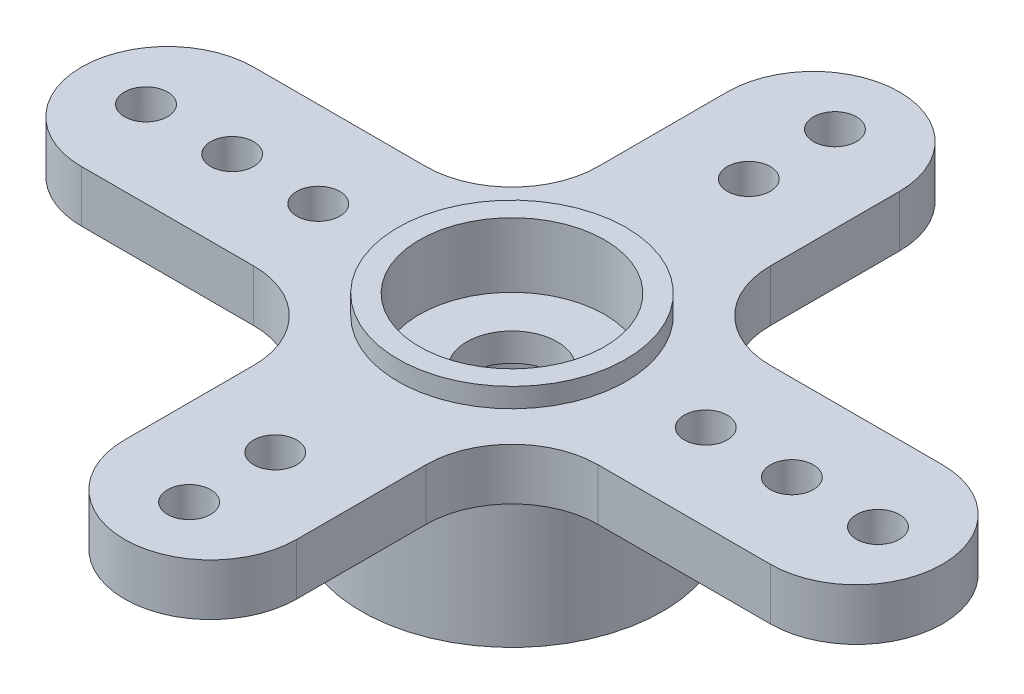
ISO-10303-21;
HEADER;
FILE_DESCRIPTION(('STEP AP214'),'2;1');
FILE_NAME('part.step','',(''),(''),'','','');
FILE_SCHEMA(('AUTOMOTIVE_DESIGN { 1 0 10303 214 1 1 1 1 }'));
ENDSEC;
DATA;
#1=APPLICATION_CONTEXT('core data for automotive mechanical design processes');
#2=APPLICATION_PROTOCOL_DEFINITION('international standard','automotive_design',2000,#1);
#3=PRODUCT_CONTEXT('',#1,'mechanical');
#4=PRODUCT('Part','Part','',(#3));
#5=PRODUCT_RELATED_PRODUCT_CATEGORY('part','',(#4));
#6=PRODUCT_DEFINITION_FORMATION('','',#4);
#7=PRODUCT_DEFINITION_CONTEXT('part definition',#1,'design');
#8=PRODUCT_DEFINITION('design','',#6,#7);
#9=PRODUCT_DEFINITION_SHAPE('','',#8);
#10=(LENGTH_UNIT() NAMED_UNIT(*) SI_UNIT(.MILLI.,.METRE.));
#11=(NAMED_UNIT(*) PLANE_ANGLE_UNIT() SI_UNIT($,.RADIAN.));
#12=(NAMED_UNIT(*) SI_UNIT($,.STERADIAN.) SOLID_ANGLE_UNIT());
#13=UNCERTAINTY_MEASURE_WITH_UNIT(LENGTH_MEASURE(1.E-05),#10,'distance_accuracy_value','');
#14=(GEOMETRIC_REPRESENTATION_CONTEXT(3) GLOBAL_UNCERTAINTY_ASSIGNED_CONTEXT((#13)) GLOBAL_UNIT_ASSIGNED_CONTEXT((#10,
#11,#12)) REPRESENTATION_CONTEXT('',''));
#15=CARTESIAN_POINT('',(0.,0.,0.));
#16=DIRECTION('',(0.,0.,1.));
#17=DIRECTION('',(1.,0.,0.));
#18=AXIS2_PLACEMENT_3D('',#15,#16,#17);
#19=CARTESIAN_POINT('',(3.5,0.500000000000001,0.));
#20=DIRECTION('',(0.,-1.,0.));
#21=DIRECTION('',(0.,0.,-1.));
#22=AXIS2_PLACEMENT_3D('',#19,#20,#21);
#23=PLANE('',#22);
#24=CARTESIAN_POINT('',(0.,0.5,0.));
#25=DIRECTION('',(0.,-1.,0.));
#26=DIRECTION('',(0.,0.,-1.));
#27=AXIS2_PLACEMENT_3D('',#24,#25,#26);
#28=CIRCLE('',#27,3.5);
#29=CARTESIAN_POINT('',(0.,0.5,-3.5));
#30=VERTEX_POINT('',#29);
#31=EDGE_CURVE('E209',#30,#30,#28,.T.);
#32=ORIENTED_EDGE('',*,*,#31,.F.);
#33=EDGE_LOOP('',(#32));
#34=FACE_BOUND('',#33,.T.);
#35=CARTESIAN_POINT('',(-6.5,0.500000000000001,0.));
#36=DIRECTION('',(0.,-1.,0.));
#37=DIRECTION('',(0.,0.,-1.));
#38=AXIS2_PLACEMENT_3D('',#35,#36,#37);
#39=CIRCLE('',#38,0.499999999999929);
#40=CARTESIAN_POINT('',(-6.5,0.500000000000001,-0.499999999999929));
#41=VERTEX_POINT('',#40);
#42=EDGE_CURVE('E233',#41,#41,#39,.T.);
#43=ORIENTED_EDGE('',*,*,#42,.F.);
#44=EDGE_LOOP('',(#43));
#45=FACE_BOUND('',#44,.T.);
#46=CARTESIAN_POINT('',(-4.5,0.500000000000001,0.));
#47=DIRECTION('',(0.,-1.,0.));
#48=DIRECTION('',(0.,0.,-1.));
#49=AXIS2_PLACEMENT_3D('',#46,#47,#48);
#50=CIRCLE('',#49,0.499999999999929);
#51=CARTESIAN_POINT('',(-4.5,0.500000000000001,-0.499999999999929));
#52=VERTEX_POINT('',#51);
#53=EDGE_CURVE('E239',#52,#52,#50,.T.);
#54=ORIENTED_EDGE('',*,*,#53,.F.);
#55=EDGE_LOOP('',(#54));
#56=FACE_BOUND('',#55,.T.);
#57=CARTESIAN_POINT('',(-8.5,0.500000000000001,0.));
#58=DIRECTION('',(0.,-1.,0.));
#59=DIRECTION('',(0.,0.,-1.));
#60=AXIS2_PLACEMENT_3D('',#57,#58,#59);
#61=CIRCLE('',#60,0.499999999999928);
#62=CARTESIAN_POINT('',(-8.5,0.500000000000001,-0.499999999999928));
#63=VERTEX_POINT('',#62);
#64=EDGE_CURVE('E245',#63,#63,#61,.T.);
#65=ORIENTED_EDGE('',*,*,#64,.F.);
#66=EDGE_LOOP('',(#65));
#67=FACE_BOUND('',#66,.T.);
#68=CARTESIAN_POINT('',(6.5,0.500000000000001,0.));
#69=DIRECTION('',(0.,-1.,0.));
#70=DIRECTION('',(0.,0.,-1.));
#71=AXIS2_PLACEMENT_3D('',#68,#69,#70);
#72=CIRCLE('',#71,0.499999999999929);
#73=CARTESIAN_POINT('',(6.5,0.500000000000001,-0.499999999999929));
#74=VERTEX_POINT('',#73);
#75=EDGE_CURVE('E251',#74,#74,#72,.T.);
#76=ORIENTED_EDGE('',*,*,#75,.F.);
#77=EDGE_LOOP('',(#76));
#78=FACE_BOUND('',#77,.T.);
#79=CARTESIAN_POINT('',(4.5,0.500000000000001,0.));
#80=DIRECTION('',(0.,-1.,0.));
#81=DIRECTION('',(0.,0.,-1.));
#82=AXIS2_PLACEMENT_3D('',#79,#80,#81);
#83=CIRCLE('',#82,0.499999999999929);
#84=CARTESIAN_POINT('',(4.5,0.500000000000001,-0.499999999999929));
#85=VERTEX_POINT('',#84);
#86=EDGE_CURVE('E257',#85,#85,#83,.T.);
#87=ORIENTED_EDGE('',*,*,#86,.F.);
#88=EDGE_LOOP('',(#87));
#89=FACE_BOUND('',#88,.T.);
#90=CARTESIAN_POINT('',(8.5,0.500000000000001,0.));
#91=DIRECTION('',(0.,-1.,0.));
#92=DIRECTION('',(0.,0.,-1.));
#93=AXIS2_PLACEMENT_3D('',#90,#91,#92);
#94=CIRCLE('',#93,0.499999999999928);
#95=CARTESIAN_POINT('',(8.5,0.500000000000001,-0.499999999999928));
#96=VERTEX_POINT('',#95);
#97=EDGE_CURVE('E263',#96,#96,#94,.T.);
#98=ORIENTED_EDGE('',*,*,#97,.F.);
#99=EDGE_LOOP('',(#98));
#100=FACE_BOUND('',#99,.T.);
#101=CARTESIAN_POINT('',(0.,0.500000000000001,-7.5));
#102=DIRECTION('',(0.,-1.,0.));
#103=DIRECTION('',(0.,0.,-1.));
#104=AXIS2_PLACEMENT_3D('',#101,#102,#103);
#105=CIRCLE('',#104,0.499999999999966);
#106=CARTESIAN_POINT('',(0.,0.500000000000001,-7.99999999999997));
#107=VERTEX_POINT('',#106);
#108=EDGE_CURVE('E269',#107,#107,#105,.T.);
#109=ORIENTED_EDGE('',*,*,#108,.F.);
#110=EDGE_LOOP('',(#109));
#111=FACE_BOUND('',#110,.T.);
#112=CARTESIAN_POINT('',(0.,0.500000000000001,-5.5));
#113=DIRECTION('',(0.,-1.,0.));
#114=DIRECTION('',(0.,0.,-1.));
#115=AXIS2_PLACEMENT_3D('',#112,#113,#114);
#116=CIRCLE('',#115,0.499999999999966);
#117=CARTESIAN_POINT('',(0.,0.500000000000001,-5.99999999999997));
#118=VERTEX_POINT('',#117);
#119=EDGE_CURVE('E275',#118,#118,#116,.T.);
#120=ORIENTED_EDGE('',*,*,#119,.F.);
#121=EDGE_LOOP('',(#120));
#122=FACE_BOUND('',#121,.T.);
#123=CARTESIAN_POINT('',(0.,0.500000000000001,7.5));
#124=DIRECTION('',(0.,-1.,0.));
#125=DIRECTION('',(0.,0.,-1.));
#126=AXIS2_PLACEMENT_3D('',#123,#124,#125);
#127=CIRCLE('',#126,0.499999999999966);
#128=CARTESIAN_POINT('',(0.,0.500000000000001,7.00000000000003));
#129=VERTEX_POINT('',#128);
#130=EDGE_CURVE('E281',#129,#129,#127,.T.);
#131=ORIENTED_EDGE('',*,*,#130,.F.);
#132=EDGE_LOOP('',(#131));
#133=FACE_BOUND('',#132,.T.);
#134=CARTESIAN_POINT('',(0.,0.500000000000001,5.5));
#135=DIRECTION('',(0.,-1.,0.));
#136=DIRECTION('',(0.,0.,-1.));
#137=AXIS2_PLACEMENT_3D('',#134,#135,#136);
#138=CIRCLE('',#137,0.499999999999966);
#139=CARTESIAN_POINT('',(0.,0.500000000000001,5.00000000000003));
#140=VERTEX_POINT('',#139);
#141=EDGE_CURVE('E287',#140,#140,#138,.T.);
#142=ORIENTED_EDGE('',*,*,#141,.F.);
#143=EDGE_LOOP('',(#142));
#144=FACE_BOUND('',#143,.T.);
#145=DIRECTION('',(-1.,0.,0.));
#146=VECTOR('',#145,1.);
#147=CARTESIAN_POINT('',(3.5,0.500000000000001,2.));
#148=LINE('',#147,#146);
#149=CARTESIAN_POINT('',(8.,0.5,2.));
#150=VERTEX_POINT('',#149);
#151=CARTESIAN_POINT('',(4.,0.500000000000001,2.));
#152=VERTEX_POINT('',#151);
#153=EDGE_CURVE('E336',#150,#152,#148,.T.);
#154=ORIENTED_EDGE('',*,*,#153,.T.);
#155=CARTESIAN_POINT('',(4.,0.5,4.));
#156=DIRECTION('',(0.,-1.,0.));
#157=DIRECTION('',(0.,0.,-1.));
#158=AXIS2_PLACEMENT_3D('',#155,#156,#157);
#159=CIRCLE('',#158,2.);
#160=CARTESIAN_POINT('',(2.,0.5,4.));
#161=VERTEX_POINT('',#160);
#162=EDGE_CURVE('E151',#152,#161,#159,.F.);
#163=ORIENTED_EDGE('',*,*,#162,.T.);
#164=DIRECTION('',(0.,0.,1.));
#165=VECTOR('',#164,1.);
#166=CARTESIAN_POINT('',(2.,0.500000000000001,0.));
#167=LINE('',#166,#165);
#168=CARTESIAN_POINT('',(2.,0.5,7.));
#169=VERTEX_POINT('',#168);
#170=EDGE_CURVE('E294',#161,#169,#167,.T.);
#171=ORIENTED_EDGE('',*,*,#170,.T.);
#172=CARTESIAN_POINT('',(0.,0.5,7.));
#173=DIRECTION('',(0.,-1.,0.));
#174=DIRECTION('',(0.,0.,-1.));
#175=AXIS2_PLACEMENT_3D('',#172,#173,#174);
#176=CIRCLE('',#175,2.);
#177=CARTESIAN_POINT('',(-2.,0.5,7.));
#178=VERTEX_POINT('',#177);
#179=EDGE_CURVE('E297',#169,#178,#176,.T.);
#180=ORIENTED_EDGE('',*,*,#179,.T.);
#181=DIRECTION('',(0.,0.,-1.));
#182=VECTOR('',#181,1.);
#183=CARTESIAN_POINT('',(-2.,0.500000000000001,0.));
#184=LINE('',#183,#182);
#185=CARTESIAN_POINT('',(-2.,0.5,4.));
#186=VERTEX_POINT('',#185);
#187=EDGE_CURVE('E300',#178,#186,#184,.T.);
#188=ORIENTED_EDGE('',*,*,#187,.T.);
#189=CARTESIAN_POINT('',(-4.,0.5,4.));
#190=DIRECTION('',(0.,-1.,0.));
#191=DIRECTION('',(0.,0.,-1.));
#192=AXIS2_PLACEMENT_3D('',#189,#190,#191);
#193=CIRCLE('',#192,2.);
#194=CARTESIAN_POINT('',(-4.,0.5,2.));
#195=VERTEX_POINT('',#194);
#196=EDGE_CURVE('E303',#186,#195,#193,.F.);
#197=ORIENTED_EDGE('',*,*,#196,.T.);
#198=DIRECTION('',(-1.,0.,0.));
#199=VECTOR('',#198,1.);
#200=CARTESIAN_POINT('',(3.5,0.500000000000001,2.));
#201=LINE('',#200,#199);
#202=CARTESIAN_POINT('',(-8.,0.5,2.));
#203=VERTEX_POINT('',#202);
#204=EDGE_CURVE('E306',#195,#203,#201,.T.);
#205=ORIENTED_EDGE('',*,*,#204,.T.);
#206=CARTESIAN_POINT('',(-8.,0.5,0.));
#207=DIRECTION('',(0.,-1.,0.));
#208=DIRECTION('',(0.,0.,-1.));
#209=AXIS2_PLACEMENT_3D('',#206,#207,#208);
#210=CIRCLE('',#209,2.);
#211=CARTESIAN_POINT('',(-8.,0.5,-2.));
#212=VERTEX_POINT('',#211);
#213=EDGE_CURVE('E309',#203,#212,#210,.T.);
#214=ORIENTED_EDGE('',*,*,#213,.T.);
#215=DIRECTION('',(1.,0.,0.));
#216=VECTOR('',#215,1.);
#217=CARTESIAN_POINT('',(3.5,0.500000000000001,-2.));
#218=LINE('',#217,#216);
#219=CARTESIAN_POINT('',(-4.,0.5,-2.));
#220=VERTEX_POINT('',#219);
#221=EDGE_CURVE('E312',#212,#220,#218,.T.);
#222=ORIENTED_EDGE('',*,*,#221,.T.);
#223=CARTESIAN_POINT('',(-4.,0.5,-4.));
#224=DIRECTION('',(0.,-1.,0.));
#225=DIRECTION('',(0.,0.,-1.));
#226=AXIS2_PLACEMENT_3D('',#223,#224,#225);
#227=CIRCLE('',#226,2.);
#228=CARTESIAN_POINT('',(-2.,0.5,-4.));
#229=VERTEX_POINT('',#228);
#230=EDGE_CURVE('E315',#220,#229,#227,.F.);
#231=ORIENTED_EDGE('',*,*,#230,.T.);
#232=DIRECTION('',(0.,0.,-1.));
#233=VECTOR('',#232,1.);
#234=CARTESIAN_POINT('',(-2.,0.500000000000001,0.));
#235=LINE('',#234,#233);
#236=CARTESIAN_POINT('',(-2.,0.5,-7.));
#237=VERTEX_POINT('',#236);
#238=EDGE_CURVE('E318',#229,#237,#235,.T.);
#239=ORIENTED_EDGE('',*,*,#238,.T.);
#240=CARTESIAN_POINT('',(0.,0.5,-7.));
#241=DIRECTION('',(0.,-1.,0.));
#242=DIRECTION('',(0.,0.,-1.));
#243=AXIS2_PLACEMENT_3D('',#240,#241,#242);
#244=CIRCLE('',#243,2.);
#245=CARTESIAN_POINT('',(2.,0.5,-7.));
#246=VERTEX_POINT('',#245);
#247=EDGE_CURVE('E321',#237,#246,#244,.T.);
#248=ORIENTED_EDGE('',*,*,#247,.T.);
#249=DIRECTION('',(0.,0.,1.));
#250=VECTOR('',#249,1.);
#251=CARTESIAN_POINT('',(2.,0.500000000000001,0.));
#252=LINE('',#251,#250);
#253=CARTESIAN_POINT('',(2.,0.5,-4.));
#254=VERTEX_POINT('',#253);
#255=EDGE_CURVE('E324',#246,#254,#252,.T.);
#256=ORIENTED_EDGE('',*,*,#255,.T.);
#257=CARTESIAN_POINT('',(4.,0.5,-4.));
#258=DIRECTION('',(0.,-1.,0.));
#259=DIRECTION('',(0.,0.,-1.));
#260=AXIS2_PLACEMENT_3D('',#257,#258,#259);
#261=CIRCLE('',#260,2.);
#262=CARTESIAN_POINT('',(4.,0.5,-2.));
#263=VERTEX_POINT('',#262);
#264=EDGE_CURVE('E327',#254,#263,#261,.F.);
#265=ORIENTED_EDGE('',*,*,#264,.T.);
#266=DIRECTION('',(1.,0.,0.));
#267=VECTOR('',#266,1.);
#268=CARTESIAN_POINT('',(3.5,0.500000000000001,-2.));
#269=LINE('',#268,#267);
#270=CARTESIAN_POINT('',(8.,0.5,-2.));
#271=VERTEX_POINT('',#270);
#272=EDGE_CURVE('E330',#263,#271,#269,.T.);
#273=ORIENTED_EDGE('',*,*,#272,.T.);
#274=CARTESIAN_POINT('',(8.,0.5,0.));
#275=DIRECTION('',(0.,-1.,0.));
#276=DIRECTION('',(0.,0.,-1.));
#277=AXIS2_PLACEMENT_3D('',#274,#275,#276);
#278=CIRCLE('',#277,2.);
#279=EDGE_CURVE('E333',#271,#150,#278,.T.);
#280=ORIENTED_EDGE('',*,*,#279,.T.);
#281=EDGE_LOOP('',(#154,#163,#171,#180,#188,#197,#205,#214,#222,#231,#239,#248,#256,#265,#273,#280));
#282=FACE_BOUND('',#281,.T.);
#283=ADVANCED_FACE('F37',(#34,#45,#56,#67,#78,#89,#100,#111,#122,#133,#144,#282),#23,.T.);
#284=CARTESIAN_POINT('',(25.,1.7,0.));
#285=DIRECTION('',(0.,1.,0.));
#286=DIRECTION('',(0.,0.,1.));
#287=AXIS2_PLACEMENT_3D('',#284,#285,#286);
#288=PLANE('',#287);
#289=CARTESIAN_POINT('',(0.,1.7,0.));
#290=DIRECTION('',(0.,-1.,0.));
#291=DIRECTION('',(0.,0.,-1.));
#292=AXIS2_PLACEMENT_3D('',#289,#290,#291);
#293=CIRCLE('',#292,2.65);
#294=CARTESIAN_POINT('',(0.,1.7,-2.65));
#295=VERTEX_POINT('',#294);
#296=EDGE_CURVE('E212',#295,#295,#293,.T.);
#297=ORIENTED_EDGE('',*,*,#296,.T.);
#298=EDGE_LOOP('',(#297));
#299=FACE_BOUND('',#298,.T.);
#300=CARTESIAN_POINT('',(-6.5,1.7,0.));
#301=DIRECTION('',(0.,1.,0.));
#302=DIRECTION('',(0.,0.,1.));
#303=AXIS2_PLACEMENT_3D('',#300,#301,#302);
#304=CIRCLE('',#303,0.499999999999953);
#305=CARTESIAN_POINT('',(-6.5,1.7,0.499999999999953));
#306=VERTEX_POINT('',#305);
#307=EDGE_CURVE('E236',#306,#306,#304,.T.);
#308=ORIENTED_EDGE('',*,*,#307,.F.);
#309=EDGE_LOOP('',(#308));
#310=FACE_BOUND('',#309,.T.);
#311=CARTESIAN_POINT('',(-4.5,1.7,0.));
#312=DIRECTION('',(0.,1.,0.));
#313=DIRECTION('',(0.,0.,1.));
#314=AXIS2_PLACEMENT_3D('',#311,#312,#313);
#315=CIRCLE('',#314,0.499999999999953);
#316=CARTESIAN_POINT('',(-4.5,1.7,0.499999999999953));
#317=VERTEX_POINT('',#316);
#318=EDGE_CURVE('E242',#317,#317,#315,.T.);
#319=ORIENTED_EDGE('',*,*,#318,.F.);
#320=EDGE_LOOP('',(#319));
#321=FACE_BOUND('',#320,.T.);
#322=CARTESIAN_POINT('',(-8.5,1.7,0.));
#323=DIRECTION('',(0.,1.,0.));
#324=DIRECTION('',(0.,0.,1.));
#325=AXIS2_PLACEMENT_3D('',#322,#323,#324);
#326=CIRCLE('',#325,0.499999999999952);
#327=CARTESIAN_POINT('',(-8.5,1.7,0.499999999999952));
#328=VERTEX_POINT('',#327);
#329=EDGE_CURVE('E248',#328,#328,#326,.T.);
#330=ORIENTED_EDGE('',*,*,#329,.F.);
#331=EDGE_LOOP('',(#330));
#332=FACE_BOUND('',#331,.T.);
#333=CARTESIAN_POINT('',(6.5,1.7,0.));
#334=DIRECTION('',(0.,1.,0.));
#335=DIRECTION('',(0.,0.,1.));
#336=AXIS2_PLACEMENT_3D('',#333,#334,#335);
#337=CIRCLE('',#336,0.499999999999953);
#338=CARTESIAN_POINT('',(6.5,1.7,0.499999999999953));
#339=VERTEX_POINT('',#338);
#340=EDGE_CURVE('E254',#339,#339,#337,.T.);
#341=ORIENTED_EDGE('',*,*,#340,.F.);
#342=EDGE_LOOP('',(#341));
#343=FACE_BOUND('',#342,.T.);
#344=CARTESIAN_POINT('',(4.5,1.7,0.));
#345=DIRECTION('',(0.,1.,0.));
#346=DIRECTION('',(0.,0.,1.));
#347=AXIS2_PLACEMENT_3D('',#344,#345,#346);
#348=CIRCLE('',#347,0.499999999999953);
#349=CARTESIAN_POINT('',(4.5,1.7,0.499999999999953));
#350=VERTEX_POINT('',#349);
#351=EDGE_CURVE('E260',#350,#350,#348,.T.);
#352=ORIENTED_EDGE('',*,*,#351,.F.);
#353=EDGE_LOOP('',(#352));
#354=FACE_BOUND('',#353,.T.);
#355=CARTESIAN_POINT('',(8.5,1.7,0.));
#356=DIRECTION('',(0.,1.,0.));
#357=DIRECTION('',(0.,0.,1.));
#358=AXIS2_PLACEMENT_3D('',#355,#356,#357);
#359=CIRCLE('',#358,0.499999999999952);
#360=CARTESIAN_POINT('',(8.5,1.7,0.499999999999952));
#361=VERTEX_POINT('',#360);
#362=EDGE_CURVE('E266',#361,#361,#359,.T.);
#363=ORIENTED_EDGE('',*,*,#362,.F.);
#364=EDGE_LOOP('',(#363));
#365=FACE_BOUND('',#364,.T.);
#366=CARTESIAN_POINT('',(0.,1.7,-7.5));
#367=DIRECTION('',(0.,1.,0.));
#368=DIRECTION('',(0.,0.,1.));
#369=AXIS2_PLACEMENT_3D('',#366,#367,#368);
#370=CIRCLE('',#369,0.49999999999999);
#371=CARTESIAN_POINT('',(0.,1.7,-7.00000000000001));
#372=VERTEX_POINT('',#371);
#373=EDGE_CURVE('E272',#372,#372,#370,.T.);
#374=ORIENTED_EDGE('',*,*,#373,.F.);
#375=EDGE_LOOP('',(#374));
#376=FACE_BOUND('',#375,.T.);
#377=CARTESIAN_POINT('',(0.,1.7,-5.5));
#378=DIRECTION('',(0.,1.,0.));
#379=DIRECTION('',(0.,0.,1.));
#380=AXIS2_PLACEMENT_3D('',#377,#378,#379);
#381=CIRCLE('',#380,0.49999999999999);
#382=CARTESIAN_POINT('',(0.,1.7,-5.00000000000001));
#383=VERTEX_POINT('',#382);
#384=EDGE_CURVE('E278',#383,#383,#381,.T.);
#385=ORIENTED_EDGE('',*,*,#384,.F.);
#386=EDGE_LOOP('',(#385));
#387=FACE_BOUND('',#386,.T.);
#388=CARTESIAN_POINT('',(0.,1.7,7.5));
#389=DIRECTION('',(0.,1.,0.));
#390=DIRECTION('',(0.,0.,1.));
#391=AXIS2_PLACEMENT_3D('',#388,#389,#390);
#392=CIRCLE('',#391,0.49999999999999);
#393=CARTESIAN_POINT('',(0.,1.7,7.99999999999999));
#394=VERTEX_POINT('',#393);
#395=EDGE_CURVE('E284',#394,#394,#392,.T.);
#396=ORIENTED_EDGE('',*,*,#395,.F.);
#397=EDGE_LOOP('',(#396));
#398=FACE_BOUND('',#397,.T.);
#399=CARTESIAN_POINT('',(0.,1.7,5.5));
#400=DIRECTION('',(0.,1.,0.));
#401=DIRECTION('',(0.,0.,1.));
#402=AXIS2_PLACEMENT_3D('',#399,#400,#401);
#403=CIRCLE('',#402,0.49999999999999);
#404=CARTESIAN_POINT('',(0.,1.7,5.99999999999999));
#405=VERTEX_POINT('',#404);
#406=EDGE_CURVE('E290',#405,#405,#403,.T.);
#407=ORIENTED_EDGE('',*,*,#406,.F.);
#408=EDGE_LOOP('',(#407));
#409=FACE_BOUND('',#408,.T.);
#410=DIRECTION('',(0.,0.,-1.));
#411=VECTOR('',#410,1.);
#412=CARTESIAN_POINT('',(2.,1.7,0.));
#413=LINE('',#412,#411);
#414=CARTESIAN_POINT('',(2.,1.7,7.));
#415=VERTEX_POINT('',#414);
#416=CARTESIAN_POINT('',(2.,1.7,4.));
#417=VERTEX_POINT('',#416);
#418=EDGE_CURVE('E45',#415,#417,#413,.T.);
#419=ORIENTED_EDGE('',*,*,#418,.T.);
#420=CARTESIAN_POINT('',(4.,1.7,4.));
#421=DIRECTION('',(0.,1.,0.));
#422=DIRECTION('',(0.,0.,1.));
#423=AXIS2_PLACEMENT_3D('',#420,#421,#422);
#424=CIRCLE('',#423,2.);
#425=CARTESIAN_POINT('',(4.,1.7,2.));
#426=VERTEX_POINT('',#425);
#427=EDGE_CURVE('E11',#417,#426,#424,.F.);
#428=ORIENTED_EDGE('',*,*,#427,.T.);
#429=DIRECTION('',(1.,0.,0.));
#430=VECTOR('',#429,1.);
#431=CARTESIAN_POINT('',(25.,1.7,2.00000000000001));
#432=LINE('',#431,#430);
#433=CARTESIAN_POINT('',(8.,1.7,2.));
#434=VERTEX_POINT('',#433);
#435=EDGE_CURVE('E155',#426,#434,#432,.T.);
#436=ORIENTED_EDGE('',*,*,#435,.T.);
#437=CARTESIAN_POINT('',(8.,1.7,0.));
#438=DIRECTION('',(0.,1.,0.));
#439=DIRECTION('',(0.,0.,1.));
#440=AXIS2_PLACEMENT_3D('',#437,#438,#439);
#441=CIRCLE('',#440,2.);
#442=CARTESIAN_POINT('',(8.,1.7,-2.));
#443=VERTEX_POINT('',#442);
#444=EDGE_CURVE('E159',#434,#443,#441,.T.);
#445=ORIENTED_EDGE('',*,*,#444,.T.);
#446=DIRECTION('',(-1.,0.,0.));
#447=VECTOR('',#446,1.);
#448=CARTESIAN_POINT('',(25.,1.7,-2.00000000000001));
#449=LINE('',#448,#447);
#450=CARTESIAN_POINT('',(4.,1.7,-2.));
#451=VERTEX_POINT('',#450);
#452=EDGE_CURVE('E200',#443,#451,#449,.T.);
#453=ORIENTED_EDGE('',*,*,#452,.T.);
#454=CARTESIAN_POINT('',(4.,1.7,-4.));
#455=DIRECTION('',(0.,1.,0.));
#456=DIRECTION('',(0.,0.,1.));
#457=AXIS2_PLACEMENT_3D('',#454,#455,#456);
#458=CIRCLE('',#457,2.);
#459=CARTESIAN_POINT('',(2.,1.7,-4.));
#460=VERTEX_POINT('',#459);
#461=EDGE_CURVE('E197',#451,#460,#458,.F.);
#462=ORIENTED_EDGE('',*,*,#461,.T.);
#463=DIRECTION('',(0.,0.,-1.));
#464=VECTOR('',#463,1.);
#465=CARTESIAN_POINT('',(2.,1.7,0.));
#466=LINE('',#465,#464);
#467=CARTESIAN_POINT('',(2.,1.7,-7.));
#468=VERTEX_POINT('',#467);
#469=EDGE_CURVE('E194',#460,#468,#466,.T.);
#470=ORIENTED_EDGE('',*,*,#469,.T.);
#471=CARTESIAN_POINT('',(0.,1.7,-7.));
#472=DIRECTION('',(0.,1.,0.));
#473=DIRECTION('',(0.,0.,1.));
#474=AXIS2_PLACEMENT_3D('',#471,#472,#473);
#475=CIRCLE('',#474,2.);
#476=CARTESIAN_POINT('',(-2.,1.7,-7.));
#477=VERTEX_POINT('',#476);
#478=EDGE_CURVE('E191',#468,#477,#475,.T.);
#479=ORIENTED_EDGE('',*,*,#478,.T.);
#480=DIRECTION('',(0.,0.,1.));
#481=VECTOR('',#480,1.);
#482=CARTESIAN_POINT('',(-2.,1.7,0.));
#483=LINE('',#482,#481);
#484=CARTESIAN_POINT('',(-2.,1.7,-4.));
#485=VERTEX_POINT('',#484);
#486=EDGE_CURVE('E188',#477,#485,#483,.T.);
#487=ORIENTED_EDGE('',*,*,#486,.T.);
#488=CARTESIAN_POINT('',(-4.,1.7,-4.));
#489=DIRECTION('',(0.,1.,0.));
#490=DIRECTION('',(0.,0.,1.));
#491=AXIS2_PLACEMENT_3D('',#488,#489,#490);
#492=CIRCLE('',#491,2.);
#493=CARTESIAN_POINT('',(-4.,1.7,-2.));
#494=VERTEX_POINT('',#493);
#495=EDGE_CURVE('E185',#485,#494,#492,.F.);
#496=ORIENTED_EDGE('',*,*,#495,.T.);
#497=DIRECTION('',(-1.,0.,0.));
#498=VECTOR('',#497,1.);
#499=CARTESIAN_POINT('',(25.,1.7,-2.));
#500=LINE('',#499,#498);
#501=CARTESIAN_POINT('',(-8.,1.7,-2.));
#502=VERTEX_POINT('',#501);
#503=EDGE_CURVE('E182',#494,#502,#500,.T.);
#504=ORIENTED_EDGE('',*,*,#503,.T.);
#505=CARTESIAN_POINT('',(-8.,1.7,0.));
#506=DIRECTION('',(0.,1.,0.));
#507=DIRECTION('',(0.,0.,1.));
#508=AXIS2_PLACEMENT_3D('',#505,#506,#507);
#509=CIRCLE('',#508,2.);
#510=CARTESIAN_POINT('',(-8.,1.7,2.));
#511=VERTEX_POINT('',#510);
#512=EDGE_CURVE('E179',#502,#511,#509,.T.);
#513=ORIENTED_EDGE('',*,*,#512,.T.);
#514=DIRECTION('',(1.,0.,0.));
#515=VECTOR('',#514,1.);
#516=CARTESIAN_POINT('',(25.,1.7,2.));
#517=LINE('',#516,#515);
#518=CARTESIAN_POINT('',(-4.,1.7,2.));
#519=VERTEX_POINT('',#518);
#520=EDGE_CURVE('E176',#511,#519,#517,.T.);
#521=ORIENTED_EDGE('',*,*,#520,.T.);
#522=CARTESIAN_POINT('',(-4.,1.7,4.));
#523=DIRECTION('',(0.,1.,0.));
#524=DIRECTION('',(0.,0.,1.));
#525=AXIS2_PLACEMENT_3D('',#522,#523,#524);
#526=CIRCLE('',#525,2.);
#527=CARTESIAN_POINT('',(-2.,1.7,4.));
#528=VERTEX_POINT('',#527);
#529=EDGE_CURVE('E173',#519,#528,#526,.F.);
#530=ORIENTED_EDGE('',*,*,#529,.T.);
#531=DIRECTION('',(0.,0.,1.));
#532=VECTOR('',#531,1.);
#533=CARTESIAN_POINT('',(-2.,1.7,0.));
#534=LINE('',#533,#532);
#535=CARTESIAN_POINT('',(-2.,1.7,7.));
#536=VERTEX_POINT('',#535);
#537=EDGE_CURVE('E169',#528,#536,#534,.T.);
#538=ORIENTED_EDGE('',*,*,#537,.T.);
#539=CARTESIAN_POINT('',(0.,1.7,7.));
#540=DIRECTION('',(0.,1.,0.));
#541=DIRECTION('',(0.,0.,1.));
#542=AXIS2_PLACEMENT_3D('',#539,#540,#541);
#543=CIRCLE('',#542,2.);
#544=EDGE_CURVE('E167',#536,#415,#543,.T.);
#545=ORIENTED_EDGE('',*,*,#544,.T.);
#546=EDGE_LOOP('',(#419,#428,#436,#445,#453,#462,#470,#479,#487,#496,#504,#513,#521,#530,#538,#545));
#547=FACE_BOUND('',#546,.T.);
#548=ADVANCED_FACE('F162',(#299,#310,#321,#332,#343,#354,#365,#376,#387,#398,#409,#547),#288,.T.);
#549=CARTESIAN_POINT('',(0.,-19.4580401394546,0.));
#550=DIRECTION('',(0.,-1.,0.));
#551=DIRECTION('',(0.,0.,-1.));
#552=AXIS2_PLACEMENT_3D('',#549,#550,#551);
#553=CYLINDRICAL_SURFACE('',#552,2.25);
#554=CARTESIAN_POINT('',(0.,-2.5,0.));
#555=DIRECTION('',(0.,-1.,0.));
#556=DIRECTION('',(0.,0.,-1.));
#557=AXIS2_PLACEMENT_3D('',#554,#555,#556);
#558=CIRCLE('',#557,2.25);
#559=CARTESIAN_POINT('',(0.,-2.5,-2.25));
#560=VERTEX_POINT('',#559);
#561=EDGE_CURVE('E160',#560,#560,#558,.T.);
#562=ORIENTED_EDGE('',*,*,#561,.T.);
#563=EDGE_LOOP('',(#562));
#564=FACE_BOUND('',#563,.T.);
#565=CARTESIAN_POINT('',(0.,0.,0.));
#566=DIRECTION('',(0.,-1.,0.));
#567=DIRECTION('',(0.,0.,-1.));
#568=AXIS2_PLACEMENT_3D('',#565,#566,#567);
#569=CIRCLE('',#568,2.25);
#570=CARTESIAN_POINT('',(0.,0.,-2.25));
#571=VERTEX_POINT('',#570);
#572=EDGE_CURVE('E230',#571,#571,#569,.T.);
#573=ORIENTED_EDGE('',*,*,#572,.F.);
#574=EDGE_LOOP('',(#573));
#575=FACE_BOUND('',#574,.T.);
#576=ADVANCED_FACE('F39',(#564,#575),#553,.F.);
#577=CARTESIAN_POINT('',(2.25,-2.5,0.));
#578=DIRECTION('',(0.,-1.,0.));
#579=DIRECTION('',(0.,0.,-1.));
#580=AXIS2_PLACEMENT_3D('',#577,#578,#579);
#581=PLANE('',#580);
#582=CARTESIAN_POINT('',(0.,-2.5,0.));
#583=DIRECTION('',(0.,-1.,0.));
#584=DIRECTION('',(0.,0.,-1.));
#585=AXIS2_PLACEMENT_3D('',#582,#583,#584);
#586=CIRCLE('',#585,3.5);
#587=CARTESIAN_POINT('',(0.,-2.5,-3.5));
#588=VERTEX_POINT('',#587);
#589=EDGE_CURVE('E206',#588,#588,#586,.T.);
#590=ORIENTED_EDGE('',*,*,#589,.T.);
#591=EDGE_LOOP('',(#590));
#592=FACE_BOUND('',#591,.T.);
#593=ORIENTED_EDGE('',*,*,#561,.F.);
#594=EDGE_LOOP('',(#593));
#595=FACE_BOUND('',#594,.T.);
#596=ADVANCED_FACE('F442',(#592,#595),#581,.T.);
#597=CARTESIAN_POINT('',(0.,-19.4580401394546,0.));
#598=DIRECTION('',(0.,-1.,0.));
#599=DIRECTION('',(0.,0.,-1.));
#600=AXIS2_PLACEMENT_3D('',#597,#598,#599);
#601=CYLINDRICAL_SURFACE('',#600,3.5);
#602=ORIENTED_EDGE('',*,*,#31,.T.);
#603=EDGE_LOOP('',(#602));
#604=FACE_BOUND('',#603,.T.);
#605=ORIENTED_EDGE('',*,*,#589,.F.);
#606=EDGE_LOOP('',(#605));
#607=FACE_BOUND('',#606,.T.);
#608=ADVANCED_FACE('F439',(#604,#607),#601,.T.);
#609=CARTESIAN_POINT('',(0.,-19.4580401394546,0.));
#610=DIRECTION('',(0.,-1.,0.));
#611=DIRECTION('',(0.,0.,-1.));
#612=AXIS2_PLACEMENT_3D('',#609,#610,#611);
#613=CYLINDRICAL_SURFACE('',#612,2.65);
#614=CARTESIAN_POINT('',(0.,2.15,0.));
#615=DIRECTION('',(0.,-1.,0.));
#616=DIRECTION('',(0.,0.,-1.));
#617=AXIS2_PLACEMENT_3D('',#614,#615,#616);
#618=CIRCLE('',#617,2.65);
#619=CARTESIAN_POINT('',(0.,2.15,-2.65));
#620=VERTEX_POINT('',#619);
#621=EDGE_CURVE('E215',#620,#620,#618,.T.);
#622=ORIENTED_EDGE('',*,*,#621,.T.);
#623=EDGE_LOOP('',(#622));
#624=FACE_BOUND('',#623,.T.);
#625=ORIENTED_EDGE('',*,*,#296,.F.);
#626=EDGE_LOOP('',(#625));
#627=FACE_BOUND('',#626,.T.);
#628=ADVANCED_FACE('F441',(#624,#627),#613,.T.);
#629=CARTESIAN_POINT('',(2.65,2.15,0.));
#630=DIRECTION('',(0.,1.,0.));
#631=DIRECTION('',(0.,0.,1.));
#632=AXIS2_PLACEMENT_3D('',#629,#630,#631);
#633=PLANE('',#632);
#634=CARTESIAN_POINT('',(0.,2.15,0.));
#635=DIRECTION('',(0.,-1.,0.));
#636=DIRECTION('',(0.,0.,-1.));
#637=AXIS2_PLACEMENT_3D('',#634,#635,#636);
#638=CIRCLE('',#637,2.15);
#639=CARTESIAN_POINT('',(0.,2.15,-2.15));
#640=VERTEX_POINT('',#639);
#641=EDGE_CURVE('E218',#640,#640,#638,.T.);
#642=ORIENTED_EDGE('',*,*,#641,.T.);
#643=EDGE_LOOP('',(#642));
#644=FACE_BOUND('',#643,.T.);
#645=ORIENTED_EDGE('',*,*,#621,.F.);
#646=EDGE_LOOP('',(#645));
#647=FACE_BOUND('',#646,.T.);
#648=ADVANCED_FACE('F478',(#644,#647),#633,.T.);
#649=CARTESIAN_POINT('',(0.,-19.4580401394546,0.));
#650=DIRECTION('',(0.,-1.,0.));
#651=DIRECTION('',(0.,0.,-1.));
#652=AXIS2_PLACEMENT_3D('',#649,#650,#651);
#653=CYLINDRICAL_SURFACE('',#652,2.15);
#654=CARTESIAN_POINT('',(0.,0.649999999999998,0.));
#655=DIRECTION('',(0.,-1.,0.));
#656=DIRECTION('',(0.,0.,-1.));
#657=AXIS2_PLACEMENT_3D('',#654,#655,#656);
#658=CIRCLE('',#657,2.15);
#659=CARTESIAN_POINT('',(0.,0.649999999999998,-2.15));
#660=VERTEX_POINT('',#659);
#661=EDGE_CURVE('E221',#660,#660,#658,.T.);
#662=ORIENTED_EDGE('',*,*,#661,.T.);
#663=EDGE_LOOP('',(#662));
#664=FACE_BOUND('',#663,.T.);
#665=ORIENTED_EDGE('',*,*,#641,.F.);
#666=EDGE_LOOP('',(#665));
#667=FACE_BOUND('',#666,.T.);
#668=ADVANCED_FACE('F472',(#664,#667),#653,.F.);
#669=CARTESIAN_POINT('',(2.15,0.649999999999997,0.));
#670=DIRECTION('',(0.,1.,0.));
#671=DIRECTION('',(0.,0.,1.));
#672=AXIS2_PLACEMENT_3D('',#669,#670,#671);
#673=PLANE('',#672);
#674=CARTESIAN_POINT('',(0.,0.649999999999998,0.));
#675=DIRECTION('',(0.,-1.,0.));
#676=DIRECTION('',(0.,0.,-1.));
#677=AXIS2_PLACEMENT_3D('',#674,#675,#676);
#678=CIRCLE('',#677,1.05);
#679=CARTESIAN_POINT('',(0.,0.649999999999998,-1.05));
#680=VERTEX_POINT('',#679);
#681=EDGE_CURVE('E224',#680,#680,#678,.T.);
#682=ORIENTED_EDGE('',*,*,#681,.T.);
#683=EDGE_LOOP('',(#682));
#684=FACE_BOUND('',#683,.T.);
#685=ORIENTED_EDGE('',*,*,#661,.F.);
#686=EDGE_LOOP('',(#685));
#687=FACE_BOUND('',#686,.T.);
#688=ADVANCED_FACE('F466',(#684,#687),#673,.T.);
#689=CARTESIAN_POINT('',(0.,-19.4580401394546,0.));
#690=DIRECTION('',(0.,-1.,0.));
#691=DIRECTION('',(0.,0.,-1.));
#692=AXIS2_PLACEMENT_3D('',#689,#690,#691);
#693=CYLINDRICAL_SURFACE('',#692,1.05);
#694=CARTESIAN_POINT('',(0.,0.,0.));
#695=DIRECTION('',(0.,-1.,0.));
#696=DIRECTION('',(0.,0.,-1.));
#697=AXIS2_PLACEMENT_3D('',#694,#695,#696);
#698=CIRCLE('',#697,1.05);
#699=CARTESIAN_POINT('',(0.,0.,-1.05));
#700=VERTEX_POINT('',#699);
#701=EDGE_CURVE('E227',#700,#700,#698,.T.);
#702=ORIENTED_EDGE('',*,*,#701,.T.);
#703=EDGE_LOOP('',(#702));
#704=FACE_BOUND('',#703,.T.);
#705=ORIENTED_EDGE('',*,*,#681,.F.);
#706=EDGE_LOOP('',(#705));
#707=FACE_BOUND('',#706,.T.);
#708=ADVANCED_FACE('F460',(#704,#707),#693,.F.);
#709=CARTESIAN_POINT('',(1.05,0.,0.));
#710=DIRECTION('',(0.,-1.,0.));
#711=DIRECTION('',(0.,0.,-1.));
#712=AXIS2_PLACEMENT_3D('',#709,#710,#711);
#713=PLANE('',#712);
#714=ORIENTED_EDGE('',*,*,#572,.T.);
#715=EDGE_LOOP('',(#714));
#716=FACE_BOUND('',#715,.T.);
#717=ORIENTED_EDGE('',*,*,#701,.F.);
#718=EDGE_LOOP('',(#717));
#719=FACE_BOUND('',#718,.T.);
#720=ADVANCED_FACE('F456',(#716,#719),#713,.T.);
#721=CARTESIAN_POINT('',(-6.5,1.7,0.));
#722=DIRECTION('',(0.,1.,0.));
#723=DIRECTION('',(0.,0.,1.));
#724=AXIS2_PLACEMENT_3D('',#721,#722,#723);
#725=CYLINDRICAL_SURFACE('',#724,0.499999999999929);
#726=ORIENTED_EDGE('',*,*,#42,.T.);
#727=EDGE_LOOP('',(#726));
#728=FACE_BOUND('',#727,.T.);
#729=ORIENTED_EDGE('',*,*,#307,.T.);
#730=EDGE_LOOP('',(#729));
#731=FACE_BOUND('',#730,.T.);
#732=ADVANCED_FACE('F459',(#728,#731),#725,.F.);
#733=CARTESIAN_POINT('',(-4.5,1.7,0.));
#734=DIRECTION('',(0.,1.,0.));
#735=DIRECTION('',(0.,0.,1.));
#736=AXIS2_PLACEMENT_3D('',#733,#734,#735);
#737=CYLINDRICAL_SURFACE('',#736,0.499999999999929);
#738=ORIENTED_EDGE('',*,*,#53,.T.);
#739=EDGE_LOOP('',(#738));
#740=FACE_BOUND('',#739,.T.);
#741=ORIENTED_EDGE('',*,*,#318,.T.);
#742=EDGE_LOOP('',(#741));
#743=FACE_BOUND('',#742,.T.);
#744=ADVANCED_FACE('F548',(#740,#743),#737,.F.);
#745=CARTESIAN_POINT('',(-8.5,1.7,0.));
#746=DIRECTION('',(0.,1.,0.));
#747=DIRECTION('',(0.,0.,1.));
#748=AXIS2_PLACEMENT_3D('',#745,#746,#747);
#749=CYLINDRICAL_SURFACE('',#748,0.499999999999928);
#750=ORIENTED_EDGE('',*,*,#64,.T.);
#751=EDGE_LOOP('',(#750));
#752=FACE_BOUND('',#751,.T.);
#753=ORIENTED_EDGE('',*,*,#329,.T.);
#754=EDGE_LOOP('',(#753));
#755=FACE_BOUND('',#754,.T.);
#756=ADVANCED_FACE('F544',(#752,#755),#749,.F.);
#757=CARTESIAN_POINT('',(6.5,1.7,0.));
#758=DIRECTION('',(0.,1.,0.));
#759=DIRECTION('',(0.,0.,1.));
#760=AXIS2_PLACEMENT_3D('',#757,#758,#759);
#761=CYLINDRICAL_SURFACE('',#760,0.499999999999929);
#762=ORIENTED_EDGE('',*,*,#75,.T.);
#763=EDGE_LOOP('',(#762));
#764=FACE_BOUND('',#763,.T.);
#765=ORIENTED_EDGE('',*,*,#340,.T.);
#766=EDGE_LOOP('',(#765));
#767=FACE_BOUND('',#766,.T.);
#768=ADVANCED_FACE('F540',(#764,#767),#761,.F.);
#769=CARTESIAN_POINT('',(4.5,1.7,0.));
#770=DIRECTION('',(0.,1.,0.));
#771=DIRECTION('',(0.,0.,1.));
#772=AXIS2_PLACEMENT_3D('',#769,#770,#771);
#773=CYLINDRICAL_SURFACE('',#772,0.499999999999929);
#774=ORIENTED_EDGE('',*,*,#86,.T.);
#775=EDGE_LOOP('',(#774));
#776=FACE_BOUND('',#775,.T.);
#777=ORIENTED_EDGE('',*,*,#351,.T.);
#778=EDGE_LOOP('',(#777));
#779=FACE_BOUND('',#778,.T.);
#780=ADVANCED_FACE('F536',(#776,#779),#773,.F.);
#781=CARTESIAN_POINT('',(8.5,1.7,0.));
#782=DIRECTION('',(0.,1.,0.));
#783=DIRECTION('',(0.,0.,1.));
#784=AXIS2_PLACEMENT_3D('',#781,#782,#783);
#785=CYLINDRICAL_SURFACE('',#784,0.499999999999928);
#786=ORIENTED_EDGE('',*,*,#97,.T.);
#787=EDGE_LOOP('',(#786));
#788=FACE_BOUND('',#787,.T.);
#789=ORIENTED_EDGE('',*,*,#362,.T.);
#790=EDGE_LOOP('',(#789));
#791=FACE_BOUND('',#790,.T.);
#792=ADVANCED_FACE('F532',(#788,#791),#785,.F.);
#793=CARTESIAN_POINT('',(0.,1.7,-7.5));
#794=DIRECTION('',(0.,1.,0.));
#795=DIRECTION('',(0.,0.,1.));
#796=AXIS2_PLACEMENT_3D('',#793,#794,#795);
#797=CYLINDRICAL_SURFACE('',#796,0.499999999999966);
#798=ORIENTED_EDGE('',*,*,#108,.T.);
#799=EDGE_LOOP('',(#798));
#800=FACE_BOUND('',#799,.T.);
#801=ORIENTED_EDGE('',*,*,#373,.T.);
#802=EDGE_LOOP('',(#801));
#803=FACE_BOUND('',#802,.T.);
#804=ADVANCED_FACE('F528',(#800,#803),#797,.F.);
#805=CARTESIAN_POINT('',(0.,1.7,-5.5));
#806=DIRECTION('',(0.,1.,0.));
#807=DIRECTION('',(0.,0.,1.));
#808=AXIS2_PLACEMENT_3D('',#805,#806,#807);
#809=CYLINDRICAL_SURFACE('',#808,0.499999999999966);
#810=ORIENTED_EDGE('',*,*,#119,.T.);
#811=EDGE_LOOP('',(#810));
#812=FACE_BOUND('',#811,.T.);
#813=ORIENTED_EDGE('',*,*,#384,.T.);
#814=EDGE_LOOP('',(#813));
#815=FACE_BOUND('',#814,.T.);
#816=ADVANCED_FACE('F521',(#812,#815),#809,.F.);
#817=CARTESIAN_POINT('',(0.,1.7,7.5));
#818=DIRECTION('',(0.,1.,0.));
#819=DIRECTION('',(0.,0.,1.));
#820=AXIS2_PLACEMENT_3D('',#817,#818,#819);
#821=CYLINDRICAL_SURFACE('',#820,0.499999999999966);
#822=ORIENTED_EDGE('',*,*,#130,.T.);
#823=EDGE_LOOP('',(#822));
#824=FACE_BOUND('',#823,.T.);
#825=ORIENTED_EDGE('',*,*,#395,.T.);
#826=EDGE_LOOP('',(#825));
#827=FACE_BOUND('',#826,.T.);
#828=ADVANCED_FACE('F513',(#824,#827),#821,.F.);
#829=CARTESIAN_POINT('',(0.,1.7,5.5));
#830=DIRECTION('',(0.,1.,0.));
#831=DIRECTION('',(0.,0.,1.));
#832=AXIS2_PLACEMENT_3D('',#829,#830,#831);
#833=CYLINDRICAL_SURFACE('',#832,0.499999999999966);
#834=ORIENTED_EDGE('',*,*,#141,.T.);
#835=EDGE_LOOP('',(#834));
#836=FACE_BOUND('',#835,.T.);
#837=ORIENTED_EDGE('',*,*,#406,.T.);
#838=EDGE_LOOP('',(#837));
#839=FACE_BOUND('',#838,.T.);
#840=ADVANCED_FACE('F511',(#836,#839),#833,.F.);
#841=CARTESIAN_POINT('',(4.,-2.5,4.));
#842=DIRECTION('',(0.,1.,0.));
#843=DIRECTION('',(0.,0.,1.));
#844=AXIS2_PLACEMENT_3D('',#841,#842,#843);
#845=CYLINDRICAL_SURFACE('',#844,2.);
#846=DIRECTION('',(0.,1.,0.));
#847=VECTOR('',#846,1.);
#848=CARTESIAN_POINT('',(4.,-2.5,2.));
#849=LINE('',#848,#847);
#850=EDGE_CURVE('E52',#152,#426,#849,.T.);
#851=ORIENTED_EDGE('',*,*,#850,.T.);
#852=ORIENTED_EDGE('',*,*,#427,.F.);
#853=DIRECTION('',(0.,1.,0.));
#854=VECTOR('',#853,1.);
#855=CARTESIAN_POINT('',(2.,-2.5,4.));
#856=LINE('',#855,#854);
#857=EDGE_CURVE('E337',#161,#417,#856,.T.);
#858=ORIENTED_EDGE('',*,*,#857,.F.);
#859=ORIENTED_EDGE('',*,*,#162,.F.);
#860=EDGE_LOOP('',(#851,#852,#858,#859));
#861=FACE_BOUND('',#860,.T.);
#862=ADVANCED_FACE('F148',(#861),#845,.F.);
#863=CARTESIAN_POINT('',(2.,-2.5,7.));
#864=DIRECTION('',(1.,0.,0.));
#865=DIRECTION('',(0.,0.,-1.));
#866=AXIS2_PLACEMENT_3D('',#863,#864,#865);
#867=PLANE('',#866);
#868=ORIENTED_EDGE('',*,*,#857,.T.);
#869=ORIENTED_EDGE('',*,*,#418,.F.);
#870=DIRECTION('',(0.,1.,0.));
#871=VECTOR('',#870,1.);
#872=CARTESIAN_POINT('',(2.,-2.5,7.));
#873=LINE('',#872,#871);
#874=EDGE_CURVE('E364',#169,#415,#873,.T.);
#875=ORIENTED_EDGE('',*,*,#874,.F.);
#876=ORIENTED_EDGE('',*,*,#170,.F.);
#877=EDGE_LOOP('',(#868,#869,#875,#876));
#878=FACE_BOUND('',#877,.T.);
#879=ADVANCED_FACE('F367',(#878),#867,.T.);
#880=CARTESIAN_POINT('',(0.,-2.5,7.));
#881=DIRECTION('',(0.,1.,0.));
#882=DIRECTION('',(0.,0.,1.));
#883=AXIS2_PLACEMENT_3D('',#880,#881,#882);
#884=CYLINDRICAL_SURFACE('',#883,2.);
#885=ORIENTED_EDGE('',*,*,#874,.T.);
#886=ORIENTED_EDGE('',*,*,#544,.F.);
#887=DIRECTION('',(0.,1.,0.));
#888=VECTOR('',#887,1.);
#889=CARTESIAN_POINT('',(-2.,-2.5,7.));
#890=LINE('',#889,#888);
#891=EDGE_CURVE('E362',#178,#536,#890,.T.);
#892=ORIENTED_EDGE('',*,*,#891,.F.);
#893=ORIENTED_EDGE('',*,*,#179,.F.);
#894=EDGE_LOOP('',(#885,#886,#892,#893));
#895=FACE_BOUND('',#894,.T.);
#896=ADVANCED_FACE('F418',(#895),#884,.T.);
#897=CARTESIAN_POINT('',(-2.,-2.5,7.));
#898=DIRECTION('',(-1.,0.,0.));
#899=DIRECTION('',(0.,0.,1.));
#900=AXIS2_PLACEMENT_3D('',#897,#898,#899);
#901=PLANE('',#900);
#902=ORIENTED_EDGE('',*,*,#891,.T.);
#903=ORIENTED_EDGE('',*,*,#537,.F.);
#904=DIRECTION('',(0.,1.,0.));
#905=VECTOR('',#904,1.);
#906=CARTESIAN_POINT('',(-2.,-2.5,4.));
#907=LINE('',#906,#905);
#908=EDGE_CURVE('E360',#186,#528,#907,.T.);
#909=ORIENTED_EDGE('',*,*,#908,.F.);
#910=ORIENTED_EDGE('',*,*,#187,.F.);
#911=EDGE_LOOP('',(#902,#903,#909,#910));
#912=FACE_BOUND('',#911,.T.);
#913=ADVANCED_FACE('F416',(#912),#901,.T.);
#914=CARTESIAN_POINT('',(-4.,-2.5,4.));
#915=DIRECTION('',(0.,1.,0.));
#916=DIRECTION('',(0.,0.,1.));
#917=AXIS2_PLACEMENT_3D('',#914,#915,#916);
#918=CYLINDRICAL_SURFACE('',#917,2.);
#919=ORIENTED_EDGE('',*,*,#908,.T.);
#920=ORIENTED_EDGE('',*,*,#529,.F.);
#921=DIRECTION('',(0.,1.,0.));
#922=VECTOR('',#921,1.);
#923=CARTESIAN_POINT('',(-4.,-2.5,2.));
#924=LINE('',#923,#922);
#925=EDGE_CURVE('E358',#195,#519,#924,.T.);
#926=ORIENTED_EDGE('',*,*,#925,.F.);
#927=ORIENTED_EDGE('',*,*,#196,.F.);
#928=EDGE_LOOP('',(#919,#920,#926,#927));
#929=FACE_BOUND('',#928,.T.);
#930=ADVANCED_FACE('F412',(#929),#918,.F.);
#931=CARTESIAN_POINT('',(-8.,-2.5,2.));
#932=DIRECTION('',(0.,0.,1.));
#933=DIRECTION('',(1.,0.,0.));
#934=AXIS2_PLACEMENT_3D('',#931,#932,#933);
#935=PLANE('',#934);
#936=ORIENTED_EDGE('',*,*,#925,.T.);
#937=ORIENTED_EDGE('',*,*,#520,.F.);
#938=DIRECTION('',(0.,1.,0.));
#939=VECTOR('',#938,1.);
#940=CARTESIAN_POINT('',(-8.,-2.5,2.));
#941=LINE('',#940,#939);
#942=EDGE_CURVE('E356',#203,#511,#941,.T.);
#943=ORIENTED_EDGE('',*,*,#942,.F.);
#944=ORIENTED_EDGE('',*,*,#204,.F.);
#945=EDGE_LOOP('',(#936,#937,#943,#944));
#946=FACE_BOUND('',#945,.T.);
#947=ADVANCED_FACE('F408',(#946),#935,.T.);
#948=CARTESIAN_POINT('',(-8.,-2.5,0.));
#949=DIRECTION('',(0.,1.,0.));
#950=DIRECTION('',(0.,0.,1.));
#951=AXIS2_PLACEMENT_3D('',#948,#949,#950);
#952=CYLINDRICAL_SURFACE('',#951,2.);
#953=ORIENTED_EDGE('',*,*,#942,.T.);
#954=ORIENTED_EDGE('',*,*,#512,.F.);
#955=DIRECTION('',(0.,1.,0.));
#956=VECTOR('',#955,1.);
#957=CARTESIAN_POINT('',(-8.,-2.5,-2.));
#958=LINE('',#957,#956);
#959=EDGE_CURVE('E354',#212,#502,#958,.T.);
#960=ORIENTED_EDGE('',*,*,#959,.F.);
#961=ORIENTED_EDGE('',*,*,#213,.F.);
#962=EDGE_LOOP('',(#953,#954,#960,#961));
#963=FACE_BOUND('',#962,.T.);
#964=ADVANCED_FACE('F404',(#963),#952,.T.);
#965=CARTESIAN_POINT('',(-8.,-2.5,-2.));
#966=DIRECTION('',(0.,0.,-1.));
#967=DIRECTION('',(-1.,0.,0.));
#968=AXIS2_PLACEMENT_3D('',#965,#966,#967);
#969=PLANE('',#968);
#970=ORIENTED_EDGE('',*,*,#959,.T.);
#971=ORIENTED_EDGE('',*,*,#503,.F.);
#972=DIRECTION('',(0.,1.,0.));
#973=VECTOR('',#972,1.);
#974=CARTESIAN_POINT('',(-4.,-2.5,-2.));
#975=LINE('',#974,#973);
#976=EDGE_CURVE('E352',#220,#494,#975,.T.);
#977=ORIENTED_EDGE('',*,*,#976,.F.);
#978=ORIENTED_EDGE('',*,*,#221,.F.);
#979=EDGE_LOOP('',(#970,#971,#977,#978));
#980=FACE_BOUND('',#979,.T.);
#981=ADVANCED_FACE('F400',(#980),#969,.T.);
#982=CARTESIAN_POINT('',(-4.,-2.5,-4.));
#983=DIRECTION('',(0.,1.,0.));
#984=DIRECTION('',(0.,0.,1.));
#985=AXIS2_PLACEMENT_3D('',#982,#983,#984);
#986=CYLINDRICAL_SURFACE('',#985,2.);
#987=ORIENTED_EDGE('',*,*,#976,.T.);
#988=ORIENTED_EDGE('',*,*,#495,.F.);
#989=DIRECTION('',(0.,1.,0.));
#990=VECTOR('',#989,1.);
#991=CARTESIAN_POINT('',(-2.,-2.5,-4.));
#992=LINE('',#991,#990);
#993=EDGE_CURVE('E350',#229,#485,#992,.T.);
#994=ORIENTED_EDGE('',*,*,#993,.F.);
#995=ORIENTED_EDGE('',*,*,#230,.F.);
#996=EDGE_LOOP('',(#987,#988,#994,#995));
#997=FACE_BOUND('',#996,.T.);
#998=ADVANCED_FACE('F396',(#997),#986,.F.);
#999=CARTESIAN_POINT('',(-2.,-2.5,-7.));
#1000=DIRECTION('',(-1.,0.,0.));
#1001=DIRECTION('',(0.,0.,1.));
#1002=AXIS2_PLACEMENT_3D('',#999,#1000,#1001);
#1003=PLANE('',#1002);
#1004=ORIENTED_EDGE('',*,*,#993,.T.);
#1005=ORIENTED_EDGE('',*,*,#486,.F.);
#1006=DIRECTION('',(0.,1.,0.));
#1007=VECTOR('',#1006,1.);
#1008=CARTESIAN_POINT('',(-2.,-2.5,-7.));
#1009=LINE('',#1008,#1007);
#1010=EDGE_CURVE('E348',#237,#477,#1009,.T.);
#1011=ORIENTED_EDGE('',*,*,#1010,.F.);
#1012=ORIENTED_EDGE('',*,*,#238,.F.);
#1013=EDGE_LOOP('',(#1004,#1005,#1011,#1012));
#1014=FACE_BOUND('',#1013,.T.);
#1015=ADVANCED_FACE('F392',(#1014),#1003,.T.);
#1016=CARTESIAN_POINT('',(0.,-2.5,-7.));
#1017=DIRECTION('',(0.,1.,0.));
#1018=DIRECTION('',(0.,0.,1.));
#1019=AXIS2_PLACEMENT_3D('',#1016,#1017,#1018);
#1020=CYLINDRICAL_SURFACE('',#1019,2.);
#1021=ORIENTED_EDGE('',*,*,#1010,.T.);
#1022=ORIENTED_EDGE('',*,*,#478,.F.);
#1023=DIRECTION('',(0.,1.,0.));
#1024=VECTOR('',#1023,1.);
#1025=CARTESIAN_POINT('',(2.,-2.5,-7.));
#1026=LINE('',#1025,#1024);
#1027=EDGE_CURVE('E346',#246,#468,#1026,.T.);
#1028=ORIENTED_EDGE('',*,*,#1027,.F.);
#1029=ORIENTED_EDGE('',*,*,#247,.F.);
#1030=EDGE_LOOP('',(#1021,#1022,#1028,#1029));
#1031=FACE_BOUND('',#1030,.T.);
#1032=ADVANCED_FACE('F388',(#1031),#1020,.T.);
#1033=CARTESIAN_POINT('',(2.,-2.5,-7.));
#1034=DIRECTION('',(1.,0.,0.));
#1035=DIRECTION('',(0.,0.,-1.));
#1036=AXIS2_PLACEMENT_3D('',#1033,#1034,#1035);
#1037=PLANE('',#1036);
#1038=ORIENTED_EDGE('',*,*,#1027,.T.);
#1039=ORIENTED_EDGE('',*,*,#469,.F.);
#1040=DIRECTION('',(0.,1.,0.));
#1041=VECTOR('',#1040,1.);
#1042=CARTESIAN_POINT('',(2.,-2.5,-4.));
#1043=LINE('',#1042,#1041);
#1044=EDGE_CURVE('E344',#254,#460,#1043,.T.);
#1045=ORIENTED_EDGE('',*,*,#1044,.F.);
#1046=ORIENTED_EDGE('',*,*,#255,.F.);
#1047=EDGE_LOOP('',(#1038,#1039,#1045,#1046));
#1048=FACE_BOUND('',#1047,.T.);
#1049=ADVANCED_FACE('F384',(#1048),#1037,.T.);
#1050=CARTESIAN_POINT('',(4.,-2.5,-4.));
#1051=DIRECTION('',(0.,1.,0.));
#1052=DIRECTION('',(0.,0.,1.));
#1053=AXIS2_PLACEMENT_3D('',#1050,#1051,#1052);
#1054=CYLINDRICAL_SURFACE('',#1053,2.);
#1055=ORIENTED_EDGE('',*,*,#1044,.T.);
#1056=ORIENTED_EDGE('',*,*,#461,.F.);
#1057=DIRECTION('',(0.,1.,0.));
#1058=VECTOR('',#1057,1.);
#1059=CARTESIAN_POINT('',(4.,-2.5,-2.));
#1060=LINE('',#1059,#1058);
#1061=EDGE_CURVE('E342',#263,#451,#1060,.T.);
#1062=ORIENTED_EDGE('',*,*,#1061,.F.);
#1063=ORIENTED_EDGE('',*,*,#264,.F.);
#1064=EDGE_LOOP('',(#1055,#1056,#1062,#1063));
#1065=FACE_BOUND('',#1064,.T.);
#1066=ADVANCED_FACE('F380',(#1065),#1054,.F.);
#1067=CARTESIAN_POINT('',(8.,-2.5,-2.));
#1068=DIRECTION('',(0.,0.,-1.));
#1069=DIRECTION('',(-1.,0.,0.));
#1070=AXIS2_PLACEMENT_3D('',#1067,#1068,#1069);
#1071=PLANE('',#1070);
#1072=ORIENTED_EDGE('',*,*,#1061,.T.);
#1073=ORIENTED_EDGE('',*,*,#452,.F.);
#1074=DIRECTION('',(0.,1.,0.));
#1075=VECTOR('',#1074,1.);
#1076=CARTESIAN_POINT('',(8.,-2.5,-2.));
#1077=LINE('',#1076,#1075);
#1078=EDGE_CURVE('E340',#271,#443,#1077,.T.);
#1079=ORIENTED_EDGE('',*,*,#1078,.F.);
#1080=ORIENTED_EDGE('',*,*,#272,.F.);
#1081=EDGE_LOOP('',(#1072,#1073,#1079,#1080));
#1082=FACE_BOUND('',#1081,.T.);
#1083=ADVANCED_FACE('F377',(#1082),#1071,.T.);
#1084=CARTESIAN_POINT('',(8.,-2.5,0.));
#1085=DIRECTION('',(0.,1.,0.));
#1086=DIRECTION('',(0.,0.,1.));
#1087=AXIS2_PLACEMENT_3D('',#1084,#1085,#1086);
#1088=CYLINDRICAL_SURFACE('',#1087,2.);
#1089=ORIENTED_EDGE('',*,*,#1078,.T.);
#1090=ORIENTED_EDGE('',*,*,#444,.F.);
#1091=DIRECTION('',(0.,1.,0.));
#1092=VECTOR('',#1091,1.);
#1093=CARTESIAN_POINT('',(8.,-2.5,2.));
#1094=LINE('',#1093,#1092);
#1095=EDGE_CURVE('E57',#150,#434,#1094,.T.);
#1096=ORIENTED_EDGE('',*,*,#1095,.F.);
#1097=ORIENTED_EDGE('',*,*,#279,.F.);
#1098=EDGE_LOOP('',(#1089,#1090,#1096,#1097));
#1099=FACE_BOUND('',#1098,.T.);
#1100=ADVANCED_FACE('F373',(#1099),#1088,.T.);
#1101=CARTESIAN_POINT('',(8.,-2.5,2.));
#1102=DIRECTION('',(0.,0.,1.));
#1103=DIRECTION('',(1.,0.,0.));
#1104=AXIS2_PLACEMENT_3D('',#1101,#1102,#1103);
#1105=PLANE('',#1104);
#1106=ORIENTED_EDGE('',*,*,#1095,.T.);
#1107=ORIENTED_EDGE('',*,*,#435,.F.);
#1108=ORIENTED_EDGE('',*,*,#850,.F.);
#1109=ORIENTED_EDGE('',*,*,#153,.F.);
#1110=EDGE_LOOP('',(#1106,#1107,#1108,#1109));
#1111=FACE_BOUND('',#1110,.T.);
#1112=ADVANCED_FACE('F156',(#1111),#1105,.T.);
#1113=CLOSED_SHELL('',(#283,#548,#576,#596,#608,#628,#648,#668,#688,#708,#720,#732,#744,#756,
#768,#780,#792,#804,#816,#828,#840,#862,#879,#896,#913,#930,#947,#964,#981,#998,#1015,#1032,
#1049,#1066,#1083,#1100,#1112));
#1114=MANIFOLD_SOLID_BREP('B2',#1113);
#1115=ADVANCED_BREP_SHAPE_REPRESENTATION('',(#18,#1114),#14);
#1116=SHAPE_DEFINITION_REPRESENTATION(#9,#1115);
ENDSEC;
END-ISO-10303-21;
